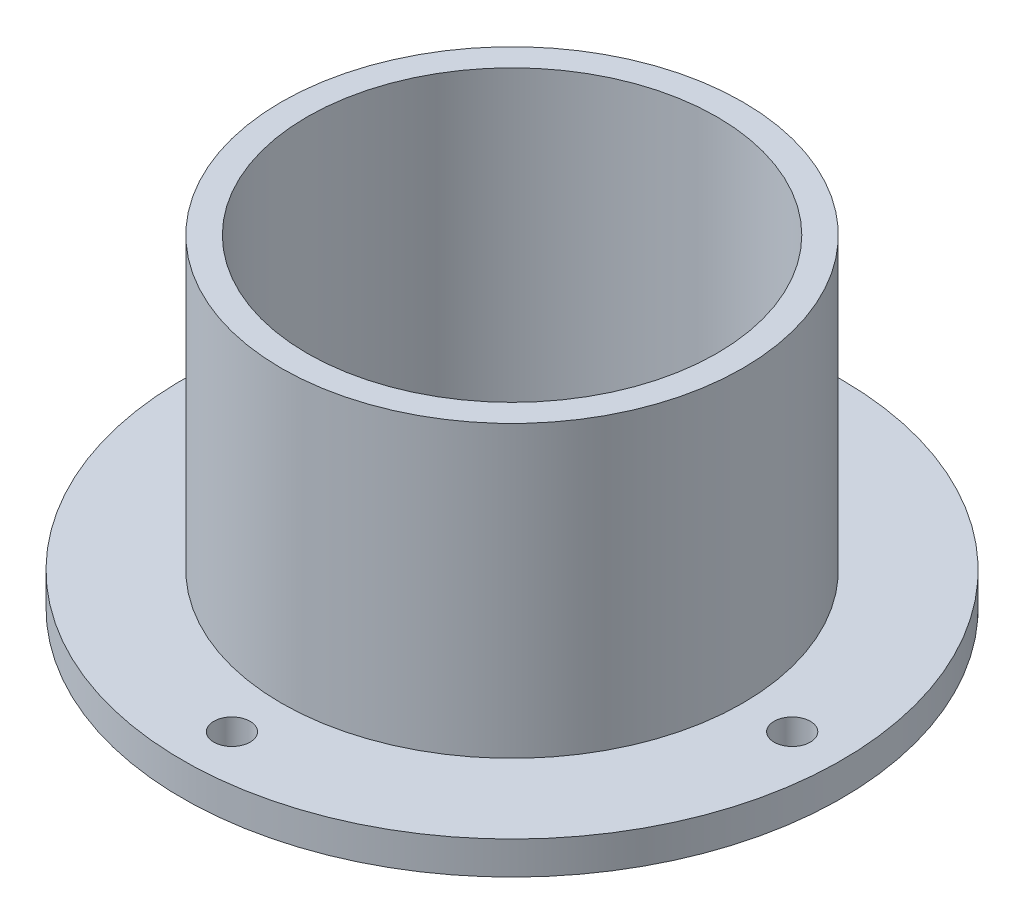
ISO-10303-21;
HEADER;
FILE_DESCRIPTION(('STEP AP214'),'2;1');
FILE_NAME('part.step','',(''),(''),'','','');
FILE_SCHEMA(('AUTOMOTIVE_DESIGN { 1 0 10303 214 1 1 1 1 }'));
ENDSEC;
DATA;
#1=APPLICATION_CONTEXT('core data for automotive mechanical design processes');
#2=APPLICATION_PROTOCOL_DEFINITION('international standard','automotive_design',2000,#1);
#3=PRODUCT_CONTEXT('',#1,'mechanical');
#4=PRODUCT('Part','Part','',(#3));
#5=PRODUCT_RELATED_PRODUCT_CATEGORY('part','',(#4));
#6=PRODUCT_DEFINITION_FORMATION('','',#4);
#7=PRODUCT_DEFINITION_CONTEXT('part definition',#1,'design');
#8=PRODUCT_DEFINITION('design','',#6,#7);
#9=PRODUCT_DEFINITION_SHAPE('','',#8);
#10=(LENGTH_UNIT() NAMED_UNIT(*) SI_UNIT(.MILLI.,.METRE.));
#11=(NAMED_UNIT(*) PLANE_ANGLE_UNIT() SI_UNIT($,.RADIAN.));
#12=(NAMED_UNIT(*) SI_UNIT($,.STERADIAN.) SOLID_ANGLE_UNIT());
#13=UNCERTAINTY_MEASURE_WITH_UNIT(LENGTH_MEASURE(1.E-05),#10,'distance_accuracy_value','');
#14=(GEOMETRIC_REPRESENTATION_CONTEXT(3) GLOBAL_UNCERTAINTY_ASSIGNED_CONTEXT((#13)) GLOBAL_UNIT_ASSIGNED_CONTEXT((#10,
#11,#12)) REPRESENTATION_CONTEXT('',''));
#15=CARTESIAN_POINT('',(0.,0.,0.));
#16=DIRECTION('',(0.,0.,1.));
#17=DIRECTION('',(1.,0.,0.));
#18=AXIS2_PLACEMENT_3D('',#15,#16,#17);
#19=CARTESIAN_POINT('',(0.,9.,0.));
#20=DIRECTION('',(0.,-1.,0.));
#21=DIRECTION('',(0.,0.,-1.));
#22=AXIS2_PLACEMENT_3D('',#19,#20,#21);
#23=CYLINDRICAL_SURFACE('',#22,35.);
#24=CARTESIAN_POINT('',(0.,9.,0.));
#25=DIRECTION('',(0.,1.,0.));
#26=DIRECTION('',(0.,0.,1.));
#27=AXIS2_PLACEMENT_3D('',#24,#25,#26);
#28=CIRCLE('',#27,35.);
#29=CARTESIAN_POINT('',(0.,9.,35.));
#30=VERTEX_POINT('',#29);
#31=EDGE_CURVE('E47',#30,#30,#28,.T.);
#32=ORIENTED_EDGE('',*,*,#31,.F.);
#33=EDGE_LOOP('',(#32));
#34=FACE_BOUND('',#33,.T.);
#35=CARTESIAN_POINT('',(0.,-35.,0.));
#36=DIRECTION('',(0.,-1.,0.));
#37=DIRECTION('',(0.,0.,-1.));
#38=AXIS2_PLACEMENT_3D('',#35,#36,#37);
#39=CIRCLE('',#38,35.);
#40=CARTESIAN_POINT('',(0.,-35.,-35.));
#41=VERTEX_POINT('',#40);
#42=EDGE_CURVE('E10',#41,#41,#39,.T.);
#43=ORIENTED_EDGE('',*,*,#42,.F.);
#44=EDGE_LOOP('',(#43));
#45=FACE_BOUND('',#44,.T.);
#46=ADVANCED_FACE('F44',(#34,#45),#23,.T.);
#47=CARTESIAN_POINT('',(0.,9.,0.));
#48=DIRECTION('',(0.,-1.,0.));
#49=DIRECTION('',(0.,0.,-1.));
#50=AXIS2_PLACEMENT_3D('',#47,#48,#49);
#51=CYLINDRICAL_SURFACE('',#50,31.0832015946794);
#52=CARTESIAN_POINT('',(0.,9.,0.));
#53=DIRECTION('',(0.,-1.,0.));
#54=DIRECTION('',(0.,0.,-1.));
#55=AXIS2_PLACEMENT_3D('',#52,#53,#54);
#56=CIRCLE('',#55,31.0832015946794);
#57=CARTESIAN_POINT('',(0.,9.,-31.0832015946794));
#58=VERTEX_POINT('',#57);
#59=EDGE_CURVE('E58',#58,#58,#56,.T.);
#60=ORIENTED_EDGE('',*,*,#59,.F.);
#61=EDGE_LOOP('',(#60));
#62=FACE_BOUND('',#61,.T.);
#63=CARTESIAN_POINT('',(0.,-40.,0.));
#64=DIRECTION('',(0.,1.,0.));
#65=DIRECTION('',(0.,0.,1.));
#66=AXIS2_PLACEMENT_3D('',#63,#64,#65);
#67=CIRCLE('',#66,31.0832015946794);
#68=CARTESIAN_POINT('',(0.,-40.,31.0832015946794));
#69=VERTEX_POINT('',#68);
#70=EDGE_CURVE('E83',#69,#69,#67,.T.);
#71=ORIENTED_EDGE('',*,*,#70,.F.);
#72=EDGE_LOOP('',(#71));
#73=FACE_BOUND('',#72,.T.);
#74=ADVANCED_FACE('F113',(#62,#73),#51,.F.);
#75=CARTESIAN_POINT('',(0.,9.,0.));
#76=DIRECTION('',(0.,1.,0.));
#77=DIRECTION('',(0.,0.,1.));
#78=AXIS2_PLACEMENT_3D('',#75,#76,#77);
#79=PLANE('',#78);
#80=ORIENTED_EDGE('',*,*,#59,.T.);
#81=EDGE_LOOP('',(#80));
#82=FACE_BOUND('',#81,.T.);
#83=ORIENTED_EDGE('',*,*,#31,.T.);
#84=EDGE_LOOP('',(#83));
#85=FACE_BOUND('',#84,.T.);
#86=ADVANCED_FACE('F115',(#82,#85),#79,.T.);
#87=CARTESIAN_POINT('',(0.,-35.,0.));
#88=DIRECTION('',(0.,-1.,0.));
#89=DIRECTION('',(0.,0.,-1.));
#90=AXIS2_PLACEMENT_3D('',#87,#88,#89);
#91=PLANE('',#90);
#92=CARTESIAN_POINT('',(0.,-35.,-42.5));
#93=DIRECTION('',(0.,1.,0.));
#94=DIRECTION('',(0.,0.,1.));
#95=AXIS2_PLACEMENT_3D('',#92,#93,#94);
#96=CIRCLE('',#95,2.75);
#97=CARTESIAN_POINT('',(0.,-35.,-39.75));
#98=VERTEX_POINT('',#97);
#99=EDGE_CURVE('E101',#98,#98,#96,.T.);
#100=ORIENTED_EDGE('',*,*,#99,.F.);
#101=EDGE_LOOP('',(#100));
#102=FACE_BOUND('',#101,.T.);
#103=CARTESIAN_POINT('',(42.5000000000012,-35.,-1.20011552744761E-12));
#104=DIRECTION('',(0.,1.,0.));
#105=DIRECTION('',(0.,0.,1.));
#106=AXIS2_PLACEMENT_3D('',#103,#104,#105);
#107=CIRCLE('',#106,2.75000000000095);
#108=CARTESIAN_POINT('',(42.5000000000012,-35.,2.74999999999974));
#109=VERTEX_POINT('',#108);
#110=EDGE_CURVE('E98',#109,#109,#107,.T.);
#111=ORIENTED_EDGE('',*,*,#110,.F.);
#112=EDGE_LOOP('',(#111));
#113=FACE_BOUND('',#112,.T.);
#114=CARTESIAN_POINT('',(2.40023105489521E-12,-35.,42.5));
#115=DIRECTION('',(0.,1.,0.));
#116=DIRECTION('',(0.,0.,1.));
#117=AXIS2_PLACEMENT_3D('',#114,#115,#116);
#118=CIRCLE('',#117,2.75000000000258);
#119=CARTESIAN_POINT('',(2.40023105489521E-12,-35.,45.2500000000026));
#120=VERTEX_POINT('',#119);
#121=EDGE_CURVE('E91',#120,#120,#118,.T.);
#122=ORIENTED_EDGE('',*,*,#121,.F.);
#123=EDGE_LOOP('',(#122));
#124=FACE_BOUND('',#123,.T.);
#125=CARTESIAN_POINT('',(-42.4999999999988,-35.,1.20532027634398E-12));
#126=DIRECTION('',(0.,1.,0.));
#127=DIRECTION('',(0.,0.,1.));
#128=AXIS2_PLACEMENT_3D('',#125,#126,#127);
#129=CIRCLE('',#128,2.75000000000193);
#130=CARTESIAN_POINT('',(-42.4999999999988,-35.,2.75000000000314));
#131=VERTEX_POINT('',#130);
#132=EDGE_CURVE('E82',#131,#131,#129,.T.);
#133=ORIENTED_EDGE('',*,*,#132,.F.);
#134=EDGE_LOOP('',(#133));
#135=FACE_BOUND('',#134,.T.);
#136=CARTESIAN_POINT('',(0.,-35.,0.));
#137=DIRECTION('',(0.,-1.,0.));
#138=DIRECTION('',(0.,0.,-1.));
#139=AXIS2_PLACEMENT_3D('',#136,#137,#138);
#140=CIRCLE('',#139,50.);
#141=CARTESIAN_POINT('',(0.,-35.,-50.));
#142=VERTEX_POINT('',#141);
#143=EDGE_CURVE('E64',#142,#142,#140,.T.);
#144=ORIENTED_EDGE('',*,*,#143,.F.);
#145=EDGE_LOOP('',(#144));
#146=FACE_BOUND('',#145,.T.);
#147=ORIENTED_EDGE('',*,*,#42,.T.);
#148=EDGE_LOOP('',(#147));
#149=FACE_BOUND('',#148,.T.);
#150=ADVANCED_FACE('F122',(#102,#113,#124,#135,#146,#149),#91,.F.);
#151=CARTESIAN_POINT('',(0.,-35.,0.));
#152=DIRECTION('',(0.,-1.,0.));
#153=DIRECTION('',(0.,0.,-1.));
#154=AXIS2_PLACEMENT_3D('',#151,#152,#153);
#155=CYLINDRICAL_SURFACE('',#154,50.);
#156=ORIENTED_EDGE('',*,*,#143,.T.);
#157=EDGE_LOOP('',(#156));
#158=FACE_BOUND('',#157,.T.);
#159=CARTESIAN_POINT('',(0.,-40.,0.));
#160=DIRECTION('',(0.,-1.,0.));
#161=DIRECTION('',(0.,0.,-1.));
#162=AXIS2_PLACEMENT_3D('',#159,#160,#161);
#163=CIRCLE('',#162,50.);
#164=CARTESIAN_POINT('',(0.,-40.,-50.));
#165=VERTEX_POINT('',#164);
#166=EDGE_CURVE('E60',#165,#165,#163,.T.);
#167=ORIENTED_EDGE('',*,*,#166,.F.);
#168=EDGE_LOOP('',(#167));
#169=FACE_BOUND('',#168,.T.);
#170=ADVANCED_FACE('F128',(#158,#169),#155,.T.);
#171=CARTESIAN_POINT('',(0.,-40.,0.));
#172=DIRECTION('',(0.,-1.,0.));
#173=DIRECTION('',(0.,0.,-1.));
#174=AXIS2_PLACEMENT_3D('',#171,#172,#173);
#175=PLANE('',#174);
#176=ORIENTED_EDGE('',*,*,#70,.T.);
#177=EDGE_LOOP('',(#176));
#178=FACE_BOUND('',#177,.T.);
#179=CARTESIAN_POINT('',(0.,-40.,-42.5));
#180=DIRECTION('',(0.,1.,0.));
#181=DIRECTION('',(0.,0.,1.));
#182=AXIS2_PLACEMENT_3D('',#179,#180,#181);
#183=CIRCLE('',#182,2.75);
#184=CARTESIAN_POINT('',(0.,-40.,-39.75));
#185=VERTEX_POINT('',#184);
#186=EDGE_CURVE('E76',#185,#185,#183,.T.);
#187=ORIENTED_EDGE('',*,*,#186,.T.);
#188=EDGE_LOOP('',(#187));
#189=FACE_BOUND('',#188,.T.);
#190=CARTESIAN_POINT('',(42.5000000000012,-40.,-1.20011552744761E-12));
#191=DIRECTION('',(0.,1.,0.));
#192=DIRECTION('',(0.,0.,1.));
#193=AXIS2_PLACEMENT_3D('',#190,#191,#192);
#194=CIRCLE('',#193,2.75000000000095);
#195=CARTESIAN_POINT('',(42.5000000000012,-40.,2.74999999999974));
#196=VERTEX_POINT('',#195);
#197=EDGE_CURVE('E95',#196,#196,#194,.T.);
#198=ORIENTED_EDGE('',*,*,#197,.T.);
#199=EDGE_LOOP('',(#198));
#200=FACE_BOUND('',#199,.T.);
#201=CARTESIAN_POINT('',(2.40023105489521E-12,-40.,42.5));
#202=DIRECTION('',(0.,1.,0.));
#203=DIRECTION('',(0.,0.,1.));
#204=AXIS2_PLACEMENT_3D('',#201,#202,#203);
#205=CIRCLE('',#204,2.75000000000258);
#206=CARTESIAN_POINT('',(2.40023105489521E-12,-40.,45.2500000000026));
#207=VERTEX_POINT('',#206);
#208=EDGE_CURVE('E87',#207,#207,#205,.T.);
#209=ORIENTED_EDGE('',*,*,#208,.T.);
#210=EDGE_LOOP('',(#209));
#211=FACE_BOUND('',#210,.T.);
#212=CARTESIAN_POINT('',(-42.4999999999988,-40.,1.20532027634398E-12));
#213=DIRECTION('',(0.,1.,0.));
#214=DIRECTION('',(0.,0.,1.));
#215=AXIS2_PLACEMENT_3D('',#212,#213,#214);
#216=CIRCLE('',#215,2.75000000000193);
#217=CARTESIAN_POINT('',(-42.4999999999988,-40.,2.75000000000314));
#218=VERTEX_POINT('',#217);
#219=EDGE_CURVE('E78',#218,#218,#216,.T.);
#220=ORIENTED_EDGE('',*,*,#219,.T.);
#221=EDGE_LOOP('',(#220));
#222=FACE_BOUND('',#221,.T.);
#223=ORIENTED_EDGE('',*,*,#166,.T.);
#224=EDGE_LOOP('',(#223));
#225=FACE_BOUND('',#224,.T.);
#226=ADVANCED_FACE('F110',(#178,#189,#200,#211,#222,#225),#175,.T.);
#227=CARTESIAN_POINT('',(-42.4999999999988,-40.,1.20532027634398E-12));
#228=DIRECTION('',(0.,1.,0.));
#229=DIRECTION('',(0.,0.,1.));
#230=AXIS2_PLACEMENT_3D('',#227,#228,#229);
#231=CYLINDRICAL_SURFACE('',#230,2.75000000000193);
#232=ORIENTED_EDGE('',*,*,#219,.F.);
#233=EDGE_LOOP('',(#232));
#234=FACE_BOUND('',#233,.T.);
#235=ORIENTED_EDGE('',*,*,#132,.T.);
#236=EDGE_LOOP('',(#235));
#237=FACE_BOUND('',#236,.T.);
#238=ADVANCED_FACE('F127',(#234,#237),#231,.F.);
#239=CARTESIAN_POINT('',(2.40023105489521E-12,-40.,42.5));
#240=DIRECTION('',(0.,1.,0.));
#241=DIRECTION('',(0.,0.,1.));
#242=AXIS2_PLACEMENT_3D('',#239,#240,#241);
#243=CYLINDRICAL_SURFACE('',#242,2.75000000000258);
#244=ORIENTED_EDGE('',*,*,#208,.F.);
#245=EDGE_LOOP('',(#244));
#246=FACE_BOUND('',#245,.T.);
#247=ORIENTED_EDGE('',*,*,#121,.T.);
#248=EDGE_LOOP('',(#247));
#249=FACE_BOUND('',#248,.T.);
#250=ADVANCED_FACE('F136',(#246,#249),#243,.F.);
#251=CARTESIAN_POINT('',(42.5000000000012,-40.,-1.20011552744761E-12));
#252=DIRECTION('',(0.,1.,0.));
#253=DIRECTION('',(0.,0.,1.));
#254=AXIS2_PLACEMENT_3D('',#251,#252,#253);
#255=CYLINDRICAL_SURFACE('',#254,2.75000000000095);
#256=ORIENTED_EDGE('',*,*,#197,.F.);
#257=EDGE_LOOP('',(#256));
#258=FACE_BOUND('',#257,.T.);
#259=ORIENTED_EDGE('',*,*,#110,.T.);
#260=EDGE_LOOP('',(#259));
#261=FACE_BOUND('',#260,.T.);
#262=ADVANCED_FACE('F140',(#258,#261),#255,.F.);
#263=CARTESIAN_POINT('',(0.,-40.,-42.5));
#264=DIRECTION('',(0.,1.,0.));
#265=DIRECTION('',(0.,0.,1.));
#266=AXIS2_PLACEMENT_3D('',#263,#264,#265);
#267=CYLINDRICAL_SURFACE('',#266,2.75);
#268=ORIENTED_EDGE('',*,*,#186,.F.);
#269=EDGE_LOOP('',(#268));
#270=FACE_BOUND('',#269,.T.);
#271=ORIENTED_EDGE('',*,*,#99,.T.);
#272=EDGE_LOOP('',(#271));
#273=FACE_BOUND('',#272,.T.);
#274=ADVANCED_FACE('F144',(#270,#273),#267,.F.);
#275=CLOSED_SHELL('',(#46,#74,#86,#150,#170,#226,#238,#250,#262,#274));
#276=MANIFOLD_SOLID_BREP('B2',#275);
#277=ADVANCED_BREP_SHAPE_REPRESENTATION('',(#18,#276),#14);
#278=SHAPE_DEFINITION_REPRESENTATION(#9,#277);
ENDSEC;
END-ISO-10303-21;
